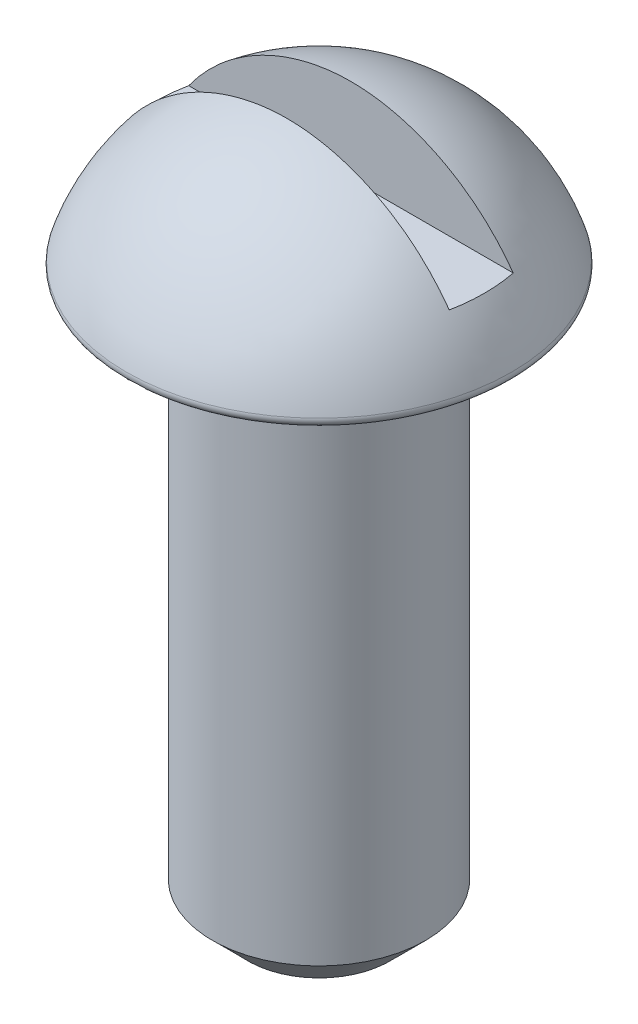
ISO-10303-21;
HEADER;
FILE_DESCRIPTION(('STEP AP214'),'2;1');
FILE_NAME('part.step','',(''),(''),'','','');
FILE_SCHEMA(('AUTOMOTIVE_DESIGN { 1 0 10303 214 1 1 1 1 }'));
ENDSEC;
DATA;
#1=APPLICATION_CONTEXT('core data for automotive mechanical design processes');
#2=APPLICATION_PROTOCOL_DEFINITION('international standard','automotive_design',2000,#1);
#3=PRODUCT_CONTEXT('',#1,'mechanical');
#4=PRODUCT('Part','Part','',(#3));
#5=PRODUCT_RELATED_PRODUCT_CATEGORY('part','',(#4));
#6=PRODUCT_DEFINITION_FORMATION('','',#4);
#7=PRODUCT_DEFINITION_CONTEXT('part definition',#1,'design');
#8=PRODUCT_DEFINITION('design','',#6,#7);
#9=PRODUCT_DEFINITION_SHAPE('','',#8);
#10=(LENGTH_UNIT() NAMED_UNIT(*) SI_UNIT(.MILLI.,.METRE.));
#11=(NAMED_UNIT(*) PLANE_ANGLE_UNIT() SI_UNIT($,.RADIAN.));
#12=(NAMED_UNIT(*) SI_UNIT($,.STERADIAN.) SOLID_ANGLE_UNIT());
#13=UNCERTAINTY_MEASURE_WITH_UNIT(LENGTH_MEASURE(1.E-05),#10,'distance_accuracy_value','');
#14=(GEOMETRIC_REPRESENTATION_CONTEXT(3) GLOBAL_UNCERTAINTY_ASSIGNED_CONTEXT((#13)) GLOBAL_UNIT_ASSIGNED_CONTEXT((#10,
#11,#12)) REPRESENTATION_CONTEXT('',''));
#15=CARTESIAN_POINT('',(0.,0.,0.));
#16=DIRECTION('',(0.,0.,1.));
#17=DIRECTION('',(1.,0.,0.));
#18=AXIS2_PLACEMENT_3D('',#15,#16,#17);
#19=CARTESIAN_POINT('',(0.,89.7703333069607,0.));
#20=DIRECTION('',(0.,1.,0.));
#21=DIRECTION('',(-1.,0.,0.));
#22=AXIS2_PLACEMENT_3D('',#19,#20,#21);
#23=DEGENERATE_TOROIDAL_SURFACE('',#22,0.0471943775454638,2.9,.F.);
#24=CARTESIAN_POINT('',(0.,90.6665500897791,0.));
#25=DIRECTION('',(0.,-1.,0.));
#26=DIRECTION('',(1.,0.,0.));
#27=AXIS2_PLACEMENT_3D('',#24,#25,#26);
#28=CIRCLE('',#27,2.71084758700014);
#29=CARTESIAN_POINT('',(2.71084758700014,90.6665500897791,0.));
#30=VERTEX_POINT('',#29);
#31=EDGE_CURVE('E62',#30,#30,#28,.F.);
#32=ORIENTED_EDGE('',*,*,#31,.T.);
#33=EDGE_LOOP('',(#32));
#34=FACE_BOUND('',#33,.T.);
#35=CARTESIAN_POINT('',(0.,91.4356460627854,0.));
#36=DIRECTION('',(0.,1.,0.));
#37=DIRECTION('',(0.,0.,1.));
#38=AXIS2_PLACEMENT_3D('',#35,#36,#37);
#39=CIRCLE('',#38,2.32698620220991);
#40=CARTESIAN_POINT('',(2.28306039895472,91.4356460627854,0.45));
#41=VERTEX_POINT('',#40);
#42=CARTESIAN_POINT('',(2.28306039895472,91.4356460627854,-0.45));
#43=VERTEX_POINT('',#42);
#44=EDGE_CURVE('E57',#41,#43,#39,.T.);
#45=ORIENTED_EDGE('',*,*,#44,.F.);
#46=CARTESIAN_POINT('',(0.,92.6273943407745,0.45));
#47=CARTESIAN_POINT('',(-0.0759413474426131,92.6273964445514,0.45));
#48=CARTESIAN_POINT('',(-0.151875405118777,92.624028453574,0.45));
#49=CARTESIAN_POINT('',(-0.303158519538401,92.6108153885685,0.45));
#50=CARTESIAN_POINT('',(-0.378507546159689,92.6009699832387,0.45));
#51=CARTESIAN_POINT('',(-0.604750329621756,92.5618744579142,0.45));
#52=CARTESIAN_POINT('',(-0.754097715457236,92.5230765707203,0.45));
#53=CARTESIAN_POINT('',(-1.04471546385965,92.4218156966886,0.45));
#54=CARTESIAN_POINT('',(-1.1859714903212,92.3593121157393,0.45));
#55=CARTESIAN_POINT('',(-1.46098405796915,92.2099687209792,0.45));
#56=CARTESIAN_POINT('',(-1.59434985801848,92.1224066693292,0.45));
#57=CARTESIAN_POINT('',(-1.84464279144157,91.9264028255811,0.45));
#58=CARTESIAN_POINT('',(-1.96157548300511,91.8179681228131,0.45));
#59=CARTESIAN_POINT('',(-2.17708546528444,91.5818478143942,0.45));
#60=CARTESIAN_POINT('',(-2.27543521786469,91.4539543786533,0.45));
#61=CARTESIAN_POINT('',(-2.44930717132202,91.1834746398396,0.45));
#62=CARTESIAN_POINT('',(-2.52482669448881,91.0408866158969,0.45));
#63=CARTESIAN_POINT('',(-2.65096563635382,90.7448924067968,0.45));
#64=CARTESIAN_POINT('',(-2.7015556691041,90.5914736971027,0.45));
#65=CARTESIAN_POINT('',(-2.77626720183047,90.2783254791248,0.45));
#66=CARTESIAN_POINT('',(-2.80038927899351,90.1185961085363,0.45));
#67=CARTESIAN_POINT('',(-2.82148663395854,89.7973100924347,0.45));
#68=CARTESIAN_POINT('',(-2.81845443627496,89.6357529559695,0.45));
#69=CARTESIAN_POINT('',(-2.78531111900897,89.3154386069281,0.45));
#70=CARTESIAN_POINT('',(-2.75519965495393,89.1566814299961,0.45));
#71=CARTESIAN_POINT('',(-2.66874874584657,88.8464693479741,0.45));
#72=CARTESIAN_POINT('',(-2.61240826793717,88.6950147307065,0.45));
#73=CARTESIAN_POINT('',(-2.47509941177096,88.4037188078954,0.45));
#74=CARTESIAN_POINT('',(-2.39413147308818,88.2638772951269,0.45));
#75=CARTESIAN_POINT('',(-2.20986616406018,87.9997914857319,0.45));
#76=CARTESIAN_POINT('',(-2.10657152074875,87.8755452871857,0.45));
#77=CARTESIAN_POINT('',(-1.88060164009489,87.646176771806,0.45));
#78=CARTESIAN_POINT('',(-1.75792643304659,87.5410544250801,0.45));
#79=CARTESIAN_POINT('',(-1.49665493851557,87.3529638919066,0.45));
#80=CARTESIAN_POINT('',(-1.35806976234538,87.2699803770021,0.45));
#81=CARTESIAN_POINT('',(-1.14134467071656,87.1639311314956,0.45));
#82=CARTESIAN_POINT('',(-1.06758251046265,87.1316388505271,0.45));
#83=CARTESIAN_POINT('',(-0.917562157667228,87.0734091726119,0.45));
#84=CARTESIAN_POINT('',(-0.841303816746174,87.0474721542191,0.45));
#85=CARTESIAN_POINT('',(-0.687034565720315,87.0022520820817,0.45));
#86=CARTESIAN_POINT('',(-0.609028104344077,86.9829538166602,0.45));
#87=CARTESIAN_POINT('',(-0.451640573456252,86.9511564653345,0.45));
#88=CARTESIAN_POINT('',(-0.372259585225904,86.9386569787988,0.45));
#89=CARTESIAN_POINT('',(-0.212758454343333,86.9207944698408,0.45));
#90=CARTESIAN_POINT('',(-0.132639014578807,86.9154252502653,0.45));
#91=CARTESIAN_POINT('',(0.0277476932978196,86.9121827393088,0.45));
#92=CARTESIAN_POINT('',(0.108014944384482,86.9143086327381,0.45));
#93=CARTESIAN_POINT('',(0.26351128220087,86.9255449014916,0.45));
#94=CARTESIAN_POINT('',(0.338770028128042,86.9342560954627,0.45));
#95=CARTESIAN_POINT('',(0.488316086468817,86.9578467727926,0.45));
#96=CARTESIAN_POINT('',(0.562603302872908,86.9727268610995,0.45));
#97=CARTESIAN_POINT('',(0.709799098010408,87.0084552482068,0.45));
#98=CARTESIAN_POINT('',(0.782706435228052,87.0293086723889,0.45));
#99=CARTESIAN_POINT('',(0.926595733964557,87.0767739489227,0.45));
#100=CARTESIAN_POINT('',(0.997577797863779,87.1033854943962,0.45));
#101=CARTESIAN_POINT('',(1.21144304890071,87.193476250999,0.45));
#102=CARTESIAN_POINT('',(1.35060783441197,87.2660900916345,0.45));
#103=CARTESIAN_POINT('',(1.61506879159697,87.4330078064256,0.45));
#104=CARTESIAN_POINT('',(1.74037029197225,87.5273033034906,0.45));
#105=CARTESIAN_POINT('',(1.97711187316815,87.7379237339405,0.45));
#106=CARTESIAN_POINT('',(2.08808248763686,87.8547778859005,0.45));
#107=CARTESIAN_POINT('',(2.28889865082631,88.1054467698086,0.45));
#108=CARTESIAN_POINT('',(2.37873899359775,88.2392656689572,0.45));
#109=CARTESIAN_POINT('',(2.53489938626514,88.5203520532256,0.45));
#110=CARTESIAN_POINT('',(2.60117071978381,88.6676466115687,0.45));
#111=CARTESIAN_POINT('',(2.70805067970449,88.9712579526772,0.45));
#112=CARTESIAN_POINT('',(2.74866089351269,89.1275741767061,0.45));
#113=CARTESIAN_POINT('',(2.80308836298712,89.444875751274,0.45));
#114=CARTESIAN_POINT('',(2.81689366521723,89.6058631524233,0.45));
#115=CARTESIAN_POINT('',(2.81728350770967,89.9278720028842,0.45));
#116=CARTESIAN_POINT('',(2.80386784053796,90.0888934524459,0.45));
#117=CARTESIAN_POINT('',(2.75019418316257,90.4064078642454,0.45));
#118=CARTESIAN_POINT('',(2.70993473332087,90.5629005797491,0.45));
#119=CARTESIAN_POINT('',(2.60371030030486,90.8669150151956,0.45));
#120=CARTESIAN_POINT('',(2.53774370672233,91.0144361724511,0.45));
#121=CARTESIAN_POINT('',(2.38196942086259,91.2963152201232,0.45));
#122=CARTESIAN_POINT('',(2.29216032421937,91.4306723345158,0.45));
#123=CARTESIAN_POINT('',(2.0912859249712,91.6823509226109,0.45));
#124=CARTESIAN_POINT('',(1.98022753371965,91.7996779136165,0.45));
#125=CARTESIAN_POINT('',(1.74007124217271,92.0139151593911,0.45));
#126=CARTESIAN_POINT('',(1.61098941611659,92.1108434157795,0.45));
#127=CARTESIAN_POINT('',(1.33823155909799,92.2817396394944,0.45));
#128=CARTESIAN_POINT('',(1.19453552305571,92.3556755560898,0.45));
#129=CARTESIAN_POINT('',(0.879861155202156,92.4851250393297,0.45));
#130=CARTESIAN_POINT('',(0.707628942373185,92.5376534875387,0.45));
#131=CARTESIAN_POINT('',(0.444606395421634,92.5909996025378,0.45));
#132=CARTESIAN_POINT('',(0.356217753403776,92.6045399406653,0.45));
#133=CARTESIAN_POINT('',(0.178548875954787,92.6227325607442,0.45));
#134=CARTESIAN_POINT('',(0.0892694014376305,92.627391867775,0.45));
#135=CARTESIAN_POINT('',(0.,92.6273943407745,0.45));
#136=B_SPLINE_CURVE_WITH_KNOTS('',3,(#46,#47,#48,#49,#50,#51,#52,#53,#54,#55,#56,#57,#58,#59,
#60,#61,#62,#63,#64,#65,#66,#67,#68,#69,#70,#71,#72,#73,#74,#75,#76,#77,#78,#79,#80,#81,#82,#83,
#84,#85,#86,#87,#88,#89,#90,#91,#92,#93,#94,#95,#96,#97,#98,#99,#100,#101,#102,#103,#104,#105,
#106,#107,#108,#109,#110,#111,#112,#113,#114,#115,#116,#117,#118,#119,#120,#121,#122,#123,#124,
#125,#126,#127,#128,#129,#130,#131,#132,#133,#134,#135),.UNSPECIFIED.,.T.,.F.,(4,2,2,2,2,2,2,2,
2,2,2,2,2,2,2,2,2,2,2,2,2,2,2,2,2,2,2,2,2,2,2,2,2,2,2,2,2,2,2,2,2,2,2,2,4),(0.,
0.227733470662116,0.455478590161967,0.916130723237915,1.37757527429023,1.85395601880428,
2.3301752466919,2.81189331718566,3.29366786549265,3.77600896113841,4.25833953815838,
4.74080290333445,5.2232724059655,5.70576090908982,6.18824080081166,6.67066179462513,
7.15308203436471,7.63516738458044,7.87649358848199,8.11783416359079,8.35861800205133,
8.59938765030518,8.83994790035734,9.08048198719985,9.3075000908204,9.53454046206807,
9.76177623038855,9.98899989119506,10.4575947050626,10.9260087723776,11.4071576462116,
11.8884249387267,12.3706812914803,12.8529078087592,13.3353493217546,13.81779451115,
14.3002659357741,14.7827675893838,15.2652976695105,15.7476710722395,16.2296169849041,
16.7122317371085,17.2488215523719,17.5167353026886,17.784437039594),.UNSPECIFIED.);
#137=CARTESIAN_POINT('',(-2.28306039895473,91.4356460627854,0.45));
#138=VERTEX_POINT('',#137);
#139=EDGE_CURVE('E51',#41,#138,#136,.T.);
#140=ORIENTED_EDGE('',*,*,#139,.T.);
#141=CARTESIAN_POINT('',(-2.28306039895473,91.4356460627854,-0.45));
#142=VERTEX_POINT('',#141);
#143=EDGE_CURVE('E65',#142,#138,#39,.T.);
#144=ORIENTED_EDGE('',*,*,#143,.F.);
#145=CARTESIAN_POINT('',(0.,92.6273943407745,-0.45));
#146=CARTESIAN_POINT('',(0.0759413474425989,92.6273964445514,-0.45));
#147=CARTESIAN_POINT('',(0.151875405118763,92.624028453574,-0.45));
#148=CARTESIAN_POINT('',(0.303158519538387,92.6108153885685,-0.45));
#149=CARTESIAN_POINT('',(0.378507546159675,92.6009699832387,-0.45));
#150=CARTESIAN_POINT('',(0.604750329621742,92.5618744579142,-0.45));
#151=CARTESIAN_POINT('',(0.754097715457221,92.5230765707203,-0.45));
#152=CARTESIAN_POINT('',(1.04471546385964,92.4218156966886,-0.45));
#153=CARTESIAN_POINT('',(1.18597149032118,92.3593121157393,-0.45));
#154=CARTESIAN_POINT('',(1.46098405796913,92.2099687209792,-0.45));
#155=CARTESIAN_POINT('',(1.59434985801847,92.1224066693292,-0.45));
#156=CARTESIAN_POINT('',(1.84464279144156,91.9264028255811,-0.45));
#157=CARTESIAN_POINT('',(1.9615754830051,91.8179681228131,-0.45));
#158=CARTESIAN_POINT('',(2.17708546528443,91.5818478143942,-0.45));
#159=CARTESIAN_POINT('',(2.27543521786468,91.4539543786533,-0.45));
#160=CARTESIAN_POINT('',(2.44930717132201,91.1834746398396,-0.45));
#161=CARTESIAN_POINT('',(2.5248266944888,91.0408866158969,-0.45));
#162=CARTESIAN_POINT('',(2.65096563635381,90.7448924067968,-0.45));
#163=CARTESIAN_POINT('',(2.70155566910409,90.5914736971027,-0.45));
#164=CARTESIAN_POINT('',(2.77626720183045,90.2783254791248,-0.45));
#165=CARTESIAN_POINT('',(2.8003892789935,90.1185961085363,-0.45));
#166=CARTESIAN_POINT('',(2.82148663395853,89.7973100924347,-0.45));
#167=CARTESIAN_POINT('',(2.81845443627495,89.6357529559695,-0.45));
#168=CARTESIAN_POINT('',(2.78531111900896,89.3154386069281,-0.45));
#169=CARTESIAN_POINT('',(2.75519965495391,89.1566814299961,-0.45));
#170=CARTESIAN_POINT('',(2.66874874584656,88.8464693479741,-0.45));
#171=CARTESIAN_POINT('',(2.61240826793716,88.6950147307065,-0.45));
#172=CARTESIAN_POINT('',(2.47509941177094,88.4037188078954,-0.45));
#173=CARTESIAN_POINT('',(2.39413147308817,88.2638772951269,-0.45));
#174=CARTESIAN_POINT('',(2.20986616406017,87.9997914857319,-0.45));
#175=CARTESIAN_POINT('',(2.10657152074874,87.8755452871857,-0.45));
#176=CARTESIAN_POINT('',(1.88060164009488,87.646176771806,-0.45));
#177=CARTESIAN_POINT('',(1.75792643304658,87.5410544250801,-0.45));
#178=CARTESIAN_POINT('',(1.49665493851556,87.3529638919066,-0.45));
#179=CARTESIAN_POINT('',(1.35806976234536,87.2699803770021,-0.45));
#180=CARTESIAN_POINT('',(1.14134467071655,87.1639311314956,-0.45));
#181=CARTESIAN_POINT('',(1.06758251046264,87.1316388505271,-0.45));
#182=CARTESIAN_POINT('',(0.917562157667214,87.0734091726119,-0.45));
#183=CARTESIAN_POINT('',(0.841303816746161,87.0474721542191,-0.45));
#184=CARTESIAN_POINT('',(0.687034565720303,87.0022520820817,-0.45));
#185=CARTESIAN_POINT('',(0.609028104344065,86.9829538166602,-0.45));
#186=CARTESIAN_POINT('',(0.45164057345624,86.9511564653345,-0.45));
#187=CARTESIAN_POINT('',(0.37225958522589,86.9386569787988,-0.45));
#188=CARTESIAN_POINT('',(0.212758454343319,86.9207944698408,-0.45));
#189=CARTESIAN_POINT('',(0.132639014578793,86.9154252502653,-0.45));
#190=CARTESIAN_POINT('',(-0.027747693297833,86.9121827393088,-0.45));
#191=CARTESIAN_POINT('',(-0.108014944384495,86.9143086327381,-0.45));
#192=CARTESIAN_POINT('',(-0.263511282200883,86.9255449014916,-0.45));
#193=CARTESIAN_POINT('',(-0.338770028128056,86.9342560954627,-0.45));
#194=CARTESIAN_POINT('',(-0.488316086468831,86.9578467727926,-0.45));
#195=CARTESIAN_POINT('',(-0.562603302872921,86.9727268610995,-0.45));
#196=CARTESIAN_POINT('',(-0.709799098010421,87.0084552482068,-0.45));
#197=CARTESIAN_POINT('',(-0.782706435228064,87.0293086723889,-0.45));
#198=CARTESIAN_POINT('',(-0.926595733964569,87.0767739489227,-0.45));
#199=CARTESIAN_POINT('',(-0.997577797863791,87.1033854943962,-0.45));
#200=CARTESIAN_POINT('',(-1.21144304890073,87.193476250999,-0.45));
#201=CARTESIAN_POINT('',(-1.35060783441197,87.2660900916345,-0.45));
#202=CARTESIAN_POINT('',(-1.61506879159698,87.4330078064256,-0.45));
#203=CARTESIAN_POINT('',(-1.74037029197226,87.5273033034906,-0.45));
#204=CARTESIAN_POINT('',(-1.97711187316816,87.7379237339405,-0.45));
#205=CARTESIAN_POINT('',(-2.08808248763687,87.8547778859005,-0.45));
#206=CARTESIAN_POINT('',(-2.28889865082632,88.1054467698086,-0.45));
#207=CARTESIAN_POINT('',(-2.37873899359776,88.2392656689572,-0.45));
#208=CARTESIAN_POINT('',(-2.53489938626516,88.5203520532256,-0.45));
#209=CARTESIAN_POINT('',(-2.60117071978383,88.6676466115687,-0.45));
#210=CARTESIAN_POINT('',(-2.7080506797045,88.9712579526772,-0.45));
#211=CARTESIAN_POINT('',(-2.7486608935127,89.1275741767061,-0.45));
#212=CARTESIAN_POINT('',(-2.80308836298714,89.444875751274,-0.45));
#213=CARTESIAN_POINT('',(-2.81689366521724,89.6058631524233,-0.45));
#214=CARTESIAN_POINT('',(-2.81728350770968,89.9278720028842,-0.45));
#215=CARTESIAN_POINT('',(-2.80386784053797,90.0888934524459,-0.45));
#216=CARTESIAN_POINT('',(-2.75019418316259,90.4064078642454,-0.45));
#217=CARTESIAN_POINT('',(-2.70993473332089,90.5629005797491,-0.45));
#218=CARTESIAN_POINT('',(-2.60371030030487,90.8669150151956,-0.45));
#219=CARTESIAN_POINT('',(-2.53774370672234,91.0144361724511,-0.45));
#220=CARTESIAN_POINT('',(-2.3819694208626,91.2963152201232,-0.45));
#221=CARTESIAN_POINT('',(-2.29216032421938,91.4306723345158,-0.45));
#222=CARTESIAN_POINT('',(-2.09128592497121,91.6823509226109,-0.45));
#223=CARTESIAN_POINT('',(-1.98022753371966,91.7996779136165,-0.45));
#224=CARTESIAN_POINT('',(-1.74007124217272,92.0139151593911,-0.45));
#225=CARTESIAN_POINT('',(-1.61098941611661,92.1108434157795,-0.45));
#226=CARTESIAN_POINT('',(-1.338231559098,92.2817396394944,-0.45));
#227=CARTESIAN_POINT('',(-1.19453552305573,92.3556755560898,-0.45));
#228=CARTESIAN_POINT('',(-0.879861155202169,92.4851250393297,-0.45));
#229=CARTESIAN_POINT('',(-0.7076289423732,92.5376534875387,-0.45));
#230=CARTESIAN_POINT('',(-0.444606395421649,92.5909996025378,-0.45));
#231=CARTESIAN_POINT('',(-0.356217753403791,92.6045399406653,-0.45));
#232=CARTESIAN_POINT('',(-0.178548875954803,92.6227325607442,-0.45));
#233=CARTESIAN_POINT('',(-0.0892694014376456,92.627391867775,-0.45));
#234=CARTESIAN_POINT('',(0.,92.6273943407745,-0.45));
#235=B_SPLINE_CURVE_WITH_KNOTS('',3,(#145,#146,#147,#148,#149,#150,#151,#152,#153,#154,#155,
#156,#157,#158,#159,#160,#161,#162,#163,#164,#165,#166,#167,#168,#169,#170,#171,#172,#173,#174,
#175,#176,#177,#178,#179,#180,#181,#182,#183,#184,#185,#186,#187,#188,#189,#190,#191,#192,#193,
#194,#195,#196,#197,#198,#199,#200,#201,#202,#203,#204,#205,#206,#207,#208,#209,#210,#211,#212,
#213,#214,#215,#216,#217,#218,#219,#220,#221,#222,#223,#224,#225,#226,#227,#228,#229,#230,#231,
#232,#233,#234),.UNSPECIFIED.,.T.,.F.,(4,2,2,2,2,2,2,2,2,2,2,2,2,2,2,2,2,2,2,2,2,2,2,2,2,2,2,2,
2,2,2,2,2,2,2,2,2,2,2,2,2,2,2,2,4),(0.,0.227733470662116,0.455478590161967,0.916130723237914,
1.37757527429023,1.85395601880428,2.3301752466919,2.81189331718566,3.29366786549265,
3.77600896113842,4.25833953815838,4.74080290333445,5.2232724059655,5.70576090908982,
6.18824080081166,6.67066179462513,7.15308203436471,7.63516738458044,7.87649358848199,
8.11783416359079,8.35861800205133,8.59938765030518,8.83994790035734,9.08048198719985,
9.3075000908204,9.53454046206807,9.76177623038855,9.98899989119507,10.4575947050626,
10.9260087723776,11.4071576462116,11.8884249387267,12.3706812914803,12.8529078087592,
13.3353493217546,13.81779451115,14.3002659357741,14.7827675893838,15.2652976695105,
15.7476710722395,16.2296169849041,16.7122317371085,17.2488215523719,17.5167353026886,
17.784437039594),.UNSPECIFIED.);
#236=EDGE_CURVE('E63',#142,#43,#235,.T.);
#237=ORIENTED_EDGE('',*,*,#236,.T.);
#238=EDGE_LOOP('',(#45,#140,#144,#237));
#239=FACE_BOUND('',#238,.T.);
#240=ADVANCED_FACE('F29',(#34,#239),#23,.F.);
#241=CARTESIAN_POINT('',(1.5,90.5356460627854,0.));
#242=DIRECTION('',(0.,1.,0.));
#243=DIRECTION('',(-1.,0.,0.));
#244=AXIS2_PLACEMENT_3D('',#241,#242,#243);
#245=PLANE('',#244);
#246=CARTESIAN_POINT('',(0.,90.5356460627854,0.));
#247=DIRECTION('',(0.,1.,0.));
#248=DIRECTION('',(-1.,0.,0.));
#249=AXIS2_PLACEMENT_3D('',#246,#247,#248);
#250=CIRCLE('',#249,2.61574269167098);
#251=CARTESIAN_POINT('',(-2.61574269167099,90.5356460627854,0.));
#252=VERTEX_POINT('',#251);
#253=EDGE_CURVE('E107',#252,#252,#250,.F.);
#254=ORIENTED_EDGE('',*,*,#253,.T.);
#255=EDGE_LOOP('',(#254));
#256=FACE_BOUND('',#255,.T.);
#257=CARTESIAN_POINT('',(0.,90.5356460627854,0.));
#258=DIRECTION('',(0.,1.,0.));
#259=DIRECTION('',(-1.,0.,0.));
#260=AXIS2_PLACEMENT_3D('',#257,#258,#259);
#261=CIRCLE('',#260,1.50000000000001);
#262=CARTESIAN_POINT('',(-1.50000000000002,90.5356460627854,0.));
#263=VERTEX_POINT('',#262);
#264=EDGE_CURVE('E69',#263,#263,#261,.T.);
#265=ORIENTED_EDGE('',*,*,#264,.T.);
#266=EDGE_LOOP('',(#265));
#267=FACE_BOUND('',#266,.T.);
#268=ADVANCED_FACE('F95',(#256,#267),#245,.F.);
#269=CARTESIAN_POINT('',(0.,125.763182897862,0.));
#270=DIRECTION('',(0.,1.,0.));
#271=DIRECTION('',(-1.,0.,0.));
#272=AXIS2_PLACEMENT_3D('',#269,#270,#271);
#273=CYLINDRICAL_SURFACE('',#272,1.50000000000001);
#274=CARTESIAN_POINT('',(0.,83.1356460627854,0.));
#275=DIRECTION('',(0.,1.,0.));
#276=DIRECTION('',(-1.,0.,0.));
#277=AXIS2_PLACEMENT_3D('',#274,#275,#276);
#278=CIRCLE('',#277,1.50000000000001);
#279=CARTESIAN_POINT('',(-1.50000000000002,83.1356460627854,0.));
#280=VERTEX_POINT('',#279);
#281=EDGE_CURVE('E37',#280,#280,#278,.T.);
#282=ORIENTED_EDGE('',*,*,#281,.T.);
#283=EDGE_LOOP('',(#282));
#284=FACE_BOUND('',#283,.T.);
#285=ORIENTED_EDGE('',*,*,#264,.F.);
#286=EDGE_LOOP('',(#285));
#287=FACE_BOUND('',#286,.T.);
#288=ADVANCED_FACE('F92',(#284,#287),#273,.T.);
#289=CARTESIAN_POINT('',(1.50000000000001,82.6356460627854,0.));
#290=DIRECTION('',(0.,1.,0.));
#291=DIRECTION('',(-1.,0.,0.));
#292=AXIS2_PLACEMENT_3D('',#289,#290,#291);
#293=PLANE('',#292);
#294=CARTESIAN_POINT('',(0.,82.6356460627854,0.));
#295=DIRECTION('',(0.,1.,0.));
#296=DIRECTION('',(-1.,0.,0.));
#297=AXIS2_PLACEMENT_3D('',#294,#295,#296);
#298=CIRCLE('',#297,1.00000000000002);
#299=CARTESIAN_POINT('',(-1.00000000000002,82.6356460627854,0.));
#300=VERTEX_POINT('',#299);
#301=EDGE_CURVE('E11',#300,#300,#298,.F.);
#302=ORIENTED_EDGE('',*,*,#301,.T.);
#303=EDGE_LOOP('',(#302));
#304=FACE_BOUND('',#303,.T.);
#305=ADVANCED_FACE('F85',(#304),#293,.F.);
#306=CARTESIAN_POINT('',(-2.75000000000001,91.4356460627854,-0.45));
#307=DIRECTION('',(0.,0.,-1.));
#308=DIRECTION('',(-1.,0.,0.));
#309=AXIS2_PLACEMENT_3D('',#306,#307,#308);
#310=PLANE('',#309);
#311=DIRECTION('',(-1.,0.,0.));
#312=VECTOR('',#311,1.);
#313=CARTESIAN_POINT('',(-2.75000000000001,91.4356460627854,-0.45));
#314=LINE('',#313,#312);
#315=EDGE_CURVE('E44',#43,#142,#314,.T.);
#316=ORIENTED_EDGE('',*,*,#315,.F.);
#317=ORIENTED_EDGE('',*,*,#236,.F.);
#318=EDGE_LOOP('',(#316,#317));
#319=FACE_BOUND('',#318,.T.);
#320=ADVANCED_FACE('F67',(#319),#310,.F.);
#321=CARTESIAN_POINT('',(-2.75000000000001,91.4356460627854,0.45));
#322=DIRECTION('',(0.,0.,1.));
#323=DIRECTION('',(1.,0.,0.));
#324=AXIS2_PLACEMENT_3D('',#321,#322,#323);
#325=PLANE('',#324);
#326=DIRECTION('',(1.,0.,0.));
#327=VECTOR('',#326,1.);
#328=CARTESIAN_POINT('',(-2.75000000000001,91.4356460627854,0.45));
#329=LINE('',#328,#327);
#330=EDGE_CURVE('E59',#138,#41,#329,.T.);
#331=ORIENTED_EDGE('',*,*,#330,.F.);
#332=ORIENTED_EDGE('',*,*,#139,.F.);
#333=EDGE_LOOP('',(#331,#332));
#334=FACE_BOUND('',#333,.T.);
#335=ADVANCED_FACE('F84',(#334),#325,.F.);
#336=CARTESIAN_POINT('',(-2.75000000000001,91.4356460627854,0.45));
#337=DIRECTION('',(0.,1.,0.));
#338=DIRECTION('',(0.,0.,1.));
#339=AXIS2_PLACEMENT_3D('',#336,#337,#338);
#340=PLANE('',#339);
#341=ORIENTED_EDGE('',*,*,#44,.T.);
#342=ORIENTED_EDGE('',*,*,#315,.T.);
#343=ORIENTED_EDGE('',*,*,#143,.T.);
#344=ORIENTED_EDGE('',*,*,#330,.T.);
#345=EDGE_LOOP('',(#341,#342,#343,#344));
#346=FACE_BOUND('',#345,.T.);
#347=ADVANCED_FACE('F58',(#346),#340,.T.);
#348=CARTESIAN_POINT('',(0.,90.6356460627854,0.));
#349=DIRECTION('',(0.,1.,0.));
#350=DIRECTION('',(-1.,0.,0.));
#351=AXIS2_PLACEMENT_3D('',#348,#349,#350);
#352=TOROIDAL_SURFACE('',#351,2.61574269167098,0.1);
#353=ORIENTED_EDGE('',*,*,#253,.F.);
#354=EDGE_LOOP('',(#353));
#355=FACE_BOUND('',#354,.T.);
#356=ORIENTED_EDGE('',*,*,#31,.F.);
#357=EDGE_LOOP('',(#356));
#358=FACE_BOUND('',#357,.T.);
#359=ADVANCED_FACE('F118',(#355,#358),#352,.T.);
#360=CARTESIAN_POINT('',(0.,83.1356460627854,0.));
#361=DIRECTION('',(0.,1.,0.));
#362=DIRECTION('',(-1.,0.,0.));
#363=AXIS2_PLACEMENT_3D('',#360,#361,#362);
#364=CONICAL_SURFACE('',#363,1.50000000000001,0.785398163397457);
#365=ORIENTED_EDGE('',*,*,#301,.F.);
#366=EDGE_LOOP('',(#365));
#367=FACE_BOUND('',#366,.T.);
#368=ORIENTED_EDGE('',*,*,#281,.F.);
#369=EDGE_LOOP('',(#368));
#370=FACE_BOUND('',#369,.T.);
#371=ADVANCED_FACE('F119',(#367,#370),#364,.T.);
#372=CLOSED_SHELL('',(#240,#268,#288,#305,#320,#335,#347,#359,#371));
#373=MANIFOLD_SOLID_BREP('B2',#372);
#374=ADVANCED_BREP_SHAPE_REPRESENTATION('',(#18,#373),#14);
#375=SHAPE_DEFINITION_REPRESENTATION(#9,#374);
ENDSEC;
END-ISO-10303-21;
